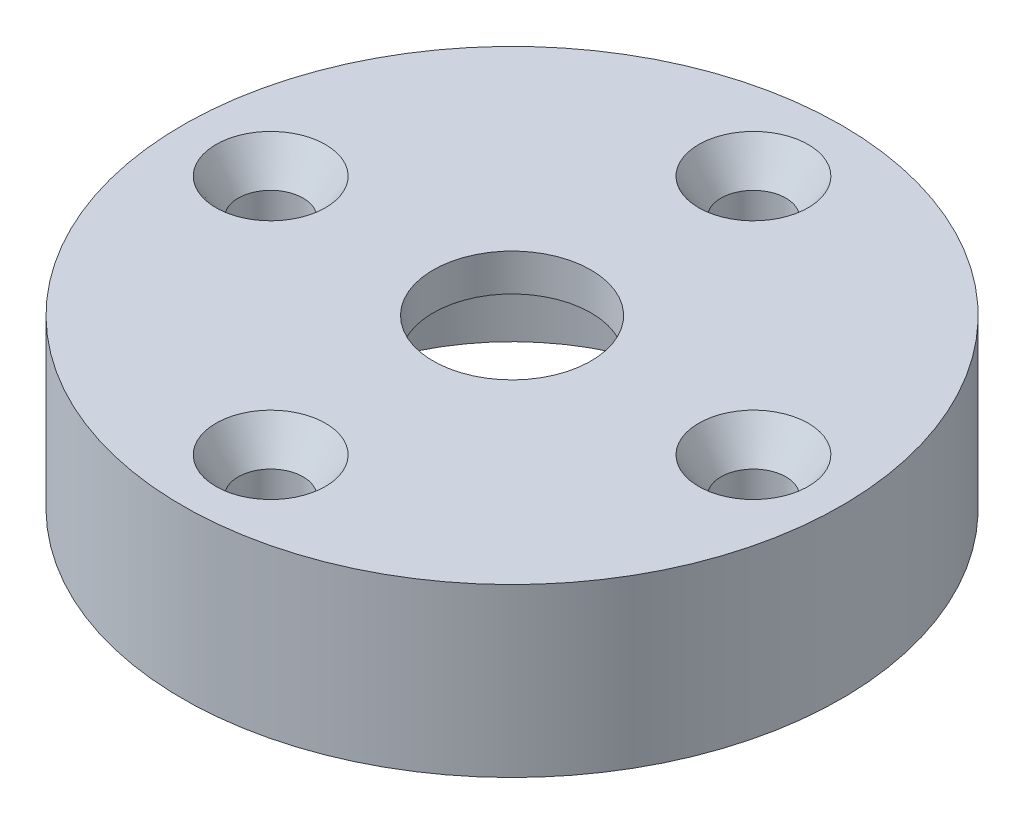
ISO-10303-21;
HEADER;
FILE_DESCRIPTION(('STEP AP214'),'2;1');
FILE_NAME('part.step','',(''),(''),'','','');
FILE_SCHEMA(('AUTOMOTIVE_DESIGN { 1 0 10303 214 1 1 1 1 }'));
ENDSEC;
DATA;
#1=APPLICATION_CONTEXT('core data for automotive mechanical design processes');
#2=APPLICATION_PROTOCOL_DEFINITION('international standard','automotive_design',2000,#1);
#3=PRODUCT_CONTEXT('',#1,'mechanical');
#4=PRODUCT('Part','Part','',(#3));
#5=PRODUCT_RELATED_PRODUCT_CATEGORY('part','',(#4));
#6=PRODUCT_DEFINITION_FORMATION('','',#4);
#7=PRODUCT_DEFINITION_CONTEXT('part definition',#1,'design');
#8=PRODUCT_DEFINITION('design','',#6,#7);
#9=PRODUCT_DEFINITION_SHAPE('','',#8);
#10=(LENGTH_UNIT() NAMED_UNIT(*) SI_UNIT(.MILLI.,.METRE.));
#11=(NAMED_UNIT(*) PLANE_ANGLE_UNIT() SI_UNIT($,.RADIAN.));
#12=(NAMED_UNIT(*) SI_UNIT($,.STERADIAN.) SOLID_ANGLE_UNIT());
#13=UNCERTAINTY_MEASURE_WITH_UNIT(LENGTH_MEASURE(1.E-05),#10,'distance_accuracy_value','');
#14=(GEOMETRIC_REPRESENTATION_CONTEXT(3) GLOBAL_UNCERTAINTY_ASSIGNED_CONTEXT((#13)) GLOBAL_UNIT_ASSIGNED_CONTEXT((#10,
#11,#12)) REPRESENTATION_CONTEXT('',''));
#15=CARTESIAN_POINT('',(0.,0.,0.));
#16=DIRECTION('',(0.,0.,1.));
#17=DIRECTION('',(1.,0.,0.));
#18=AXIS2_PLACEMENT_3D('',#15,#16,#17);
#19=CARTESIAN_POINT('',(0.,0.,0.));
#20=DIRECTION('',(0.,-1.,0.));
#21=DIRECTION('',(0.,0.,-1.));
#22=AXIS2_PLACEMENT_3D('',#19,#20,#21);
#23=CYLINDRICAL_SURFACE('',#22,11.);
#24=CARTESIAN_POINT('',(0.,7.,0.));
#25=DIRECTION('',(0.,-1.,0.));
#26=DIRECTION('',(0.,0.,-1.));
#27=AXIS2_PLACEMENT_3D('',#24,#25,#26);
#28=CIRCLE('',#27,11.);
#29=CARTESIAN_POINT('',(0.,7.,-11.));
#30=VERTEX_POINT('',#29);
#31=EDGE_CURVE('E100',#30,#30,#28,.T.);
#32=ORIENTED_EDGE('',*,*,#31,.F.);
#33=EDGE_LOOP('',(#32));
#34=FACE_BOUND('',#33,.T.);
#35=CARTESIAN_POINT('',(0.,0.,0.));
#36=DIRECTION('',(0.,-1.,0.));
#37=DIRECTION('',(0.,0.,-1.));
#38=AXIS2_PLACEMENT_3D('',#35,#36,#37);
#39=CIRCLE('',#38,11.);
#40=CARTESIAN_POINT('',(0.,0.,-11.));
#41=VERTEX_POINT('',#40);
#42=EDGE_CURVE('E80',#41,#41,#39,.T.);
#43=ORIENTED_EDGE('',*,*,#42,.T.);
#44=EDGE_LOOP('',(#43));
#45=FACE_BOUND('',#44,.T.);
#46=ADVANCED_FACE('F39',(#34,#45),#23,.F.);
#47=CARTESIAN_POINT('',(-11.,0.,0.));
#48=DIRECTION('',(0.,1.,0.));
#49=DIRECTION('',(0.,0.,1.));
#50=AXIS2_PLACEMENT_3D('',#47,#48,#49);
#51=PLANE('',#50);
#52=CARTESIAN_POINT('',(0.,0.,-13.));
#53=DIRECTION('',(0.,1.,0.));
#54=DIRECTION('',(0.,0.,1.));
#55=AXIS2_PLACEMENT_3D('',#52,#53,#54);
#56=CIRCLE('',#55,1.75);
#57=CARTESIAN_POINT('',(0.,0.,-11.25));
#58=VERTEX_POINT('',#57);
#59=EDGE_CURVE('E104',#58,#58,#56,.F.);
#60=ORIENTED_EDGE('',*,*,#59,.F.);
#61=EDGE_LOOP('',(#60));
#62=FACE_BOUND('',#61,.T.);
#63=CARTESIAN_POINT('',(13.,0.,0.));
#64=DIRECTION('',(0.,1.,0.));
#65=DIRECTION('',(0.,0.,1.));
#66=AXIS2_PLACEMENT_3D('',#63,#64,#65);
#67=CIRCLE('',#66,1.75000000000046);
#68=CARTESIAN_POINT('',(13.,0.,1.75000000000046));
#69=VERTEX_POINT('',#68);
#70=EDGE_CURVE('E113',#69,#69,#67,.F.);
#71=ORIENTED_EDGE('',*,*,#70,.F.);
#72=EDGE_LOOP('',(#71));
#73=FACE_BOUND('',#72,.T.);
#74=CARTESIAN_POINT('',(0.,0.,13.));
#75=DIRECTION('',(0.,1.,0.));
#76=DIRECTION('',(0.,0.,1.));
#77=AXIS2_PLACEMENT_3D('',#74,#75,#76);
#78=CIRCLE('',#77,1.7500000000007);
#79=CARTESIAN_POINT('',(0.,0.,14.7500000000007));
#80=VERTEX_POINT('',#79);
#81=EDGE_CURVE('E109',#80,#80,#78,.F.);
#82=ORIENTED_EDGE('',*,*,#81,.F.);
#83=EDGE_LOOP('',(#82));
#84=FACE_BOUND('',#83,.T.);
#85=CARTESIAN_POINT('',(-13.,0.,0.));
#86=DIRECTION('',(0.,1.,0.));
#87=DIRECTION('',(0.,0.,1.));
#88=AXIS2_PLACEMENT_3D('',#85,#86,#87);
#89=CIRCLE('',#88,1.75000000000024);
#90=CARTESIAN_POINT('',(-13.,0.,1.75000000000024));
#91=VERTEX_POINT('',#90);
#92=EDGE_CURVE('E105',#91,#91,#89,.F.);
#93=ORIENTED_EDGE('',*,*,#92,.F.);
#94=EDGE_LOOP('',(#93));
#95=FACE_BOUND('',#94,.T.);
#96=ORIENTED_EDGE('',*,*,#42,.F.);
#97=EDGE_LOOP('',(#96));
#98=FACE_BOUND('',#97,.T.);
#99=CARTESIAN_POINT('',(0.,0.,0.));
#100=DIRECTION('',(0.,-1.,0.));
#101=DIRECTION('',(0.,0.,-1.));
#102=AXIS2_PLACEMENT_3D('',#99,#100,#101);
#103=CIRCLE('',#102,17.75);
#104=CARTESIAN_POINT('',(0.,0.,-17.75));
#105=VERTEX_POINT('',#104);
#106=EDGE_CURVE('E84',#105,#105,#103,.T.);
#107=ORIENTED_EDGE('',*,*,#106,.T.);
#108=EDGE_LOOP('',(#107));
#109=FACE_BOUND('',#108,.T.);
#110=ADVANCED_FACE('F123',(#62,#73,#84,#95,#98,#109),#51,.F.);
#111=CARTESIAN_POINT('',(0.,0.,0.));
#112=DIRECTION('',(0.,-1.,0.));
#113=DIRECTION('',(0.,0.,-1.));
#114=AXIS2_PLACEMENT_3D('',#111,#112,#113);
#115=CYLINDRICAL_SURFACE('',#114,17.75);
#116=ORIENTED_EDGE('',*,*,#106,.F.);
#117=EDGE_LOOP('',(#116));
#118=FACE_BOUND('',#117,.T.);
#119=CARTESIAN_POINT('',(0.,9.,0.));
#120=DIRECTION('',(0.,-1.,0.));
#121=DIRECTION('',(0.,0.,-1.));
#122=AXIS2_PLACEMENT_3D('',#119,#120,#121);
#123=CIRCLE('',#122,17.75);
#124=CARTESIAN_POINT('',(0.,9.,-17.75));
#125=VERTEX_POINT('',#124);
#126=EDGE_CURVE('E88',#125,#125,#123,.T.);
#127=ORIENTED_EDGE('',*,*,#126,.T.);
#128=EDGE_LOOP('',(#127));
#129=FACE_BOUND('',#128,.T.);
#130=ADVANCED_FACE('F126',(#118,#129),#115,.T.);
#131=CARTESIAN_POINT('',(-17.75,9.,0.));
#132=DIRECTION('',(0.,-1.,0.));
#133=DIRECTION('',(0.,0.,-1.));
#134=AXIS2_PLACEMENT_3D('',#131,#132,#133);
#135=PLANE('',#134);
#136=CARTESIAN_POINT('',(0.,9.,13.));
#137=DIRECTION('',(0.,-1.,0.));
#138=DIRECTION('',(0.,0.,-1.));
#139=AXIS2_PLACEMENT_3D('',#136,#137,#138);
#140=CIRCLE('',#139,2.9500000000007);
#141=CARTESIAN_POINT('',(0.,9.,15.9500000000007));
#142=VERTEX_POINT('',#141);
#143=EDGE_CURVE('E58',#142,#142,#140,.T.);
#144=ORIENTED_EDGE('',*,*,#143,.T.);
#145=EDGE_LOOP('',(#144));
#146=FACE_BOUND('',#145,.T.);
#147=CARTESIAN_POINT('',(13.,9.,0.));
#148=DIRECTION('',(0.,-1.,0.));
#149=DIRECTION('',(0.,0.,-1.));
#150=AXIS2_PLACEMENT_3D('',#147,#148,#149);
#151=CIRCLE('',#150,2.95000000000047);
#152=CARTESIAN_POINT('',(13.,9.,-2.95000000000047));
#153=VERTEX_POINT('',#152);
#154=EDGE_CURVE('E64',#153,#153,#151,.T.);
#155=ORIENTED_EDGE('',*,*,#154,.T.);
#156=EDGE_LOOP('',(#155));
#157=FACE_BOUND('',#156,.T.);
#158=CARTESIAN_POINT('',(0.,9.,-13.));
#159=DIRECTION('',(0.,-1.,0.));
#160=DIRECTION('',(0.,0.,-1.));
#161=AXIS2_PLACEMENT_3D('',#158,#159,#160);
#162=CIRCLE('',#161,2.95);
#163=CARTESIAN_POINT('',(0.,9.,-10.05));
#164=VERTEX_POINT('',#163);
#165=EDGE_CURVE('E68',#164,#164,#162,.T.);
#166=ORIENTED_EDGE('',*,*,#165,.T.);
#167=EDGE_LOOP('',(#166));
#168=FACE_BOUND('',#167,.T.);
#169=CARTESIAN_POINT('',(-13.,9.,0.));
#170=DIRECTION('',(0.,-1.,0.));
#171=DIRECTION('',(0.,0.,-1.));
#172=AXIS2_PLACEMENT_3D('',#169,#170,#171);
#173=CIRCLE('',#172,2.95000000000025);
#174=CARTESIAN_POINT('',(-13.,9.,-2.95000000000025));
#175=VERTEX_POINT('',#174);
#176=EDGE_CURVE('E72',#175,#175,#173,.T.);
#177=ORIENTED_EDGE('',*,*,#176,.T.);
#178=EDGE_LOOP('',(#177));
#179=FACE_BOUND('',#178,.T.);
#180=ORIENTED_EDGE('',*,*,#126,.F.);
#181=EDGE_LOOP('',(#180));
#182=FACE_BOUND('',#181,.T.);
#183=CARTESIAN_POINT('',(0.,9.,0.));
#184=DIRECTION('',(0.,-1.,0.));
#185=DIRECTION('',(0.,0.,-1.));
#186=AXIS2_PLACEMENT_3D('',#183,#184,#185);
#187=CIRCLE('',#186,4.25);
#188=CARTESIAN_POINT('',(0.,9.,-4.25));
#189=VERTEX_POINT('',#188);
#190=EDGE_CURVE('E92',#189,#189,#187,.T.);
#191=ORIENTED_EDGE('',*,*,#190,.T.);
#192=EDGE_LOOP('',(#191));
#193=FACE_BOUND('',#192,.T.);
#194=ADVANCED_FACE('F140',(#146,#157,#168,#179,#182,#193),#135,.F.);
#195=CARTESIAN_POINT('',(0.,0.,0.));
#196=DIRECTION('',(0.,-1.,0.));
#197=DIRECTION('',(0.,0.,-1.));
#198=AXIS2_PLACEMENT_3D('',#195,#196,#197);
#199=CYLINDRICAL_SURFACE('',#198,4.25);
#200=ORIENTED_EDGE('',*,*,#190,.F.);
#201=EDGE_LOOP('',(#200));
#202=FACE_BOUND('',#201,.T.);
#203=CARTESIAN_POINT('',(0.,7.,0.));
#204=DIRECTION('',(0.,-1.,0.));
#205=DIRECTION('',(0.,0.,-1.));
#206=AXIS2_PLACEMENT_3D('',#203,#204,#205);
#207=CIRCLE('',#206,4.25);
#208=CARTESIAN_POINT('',(0.,7.,-4.25));
#209=VERTEX_POINT('',#208);
#210=EDGE_CURVE('E96',#209,#209,#207,.T.);
#211=ORIENTED_EDGE('',*,*,#210,.T.);
#212=EDGE_LOOP('',(#211));
#213=FACE_BOUND('',#212,.T.);
#214=ADVANCED_FACE('F146',(#202,#213),#199,.F.);
#215=CARTESIAN_POINT('',(-4.25,7.,0.));
#216=DIRECTION('',(0.,1.,0.));
#217=DIRECTION('',(0.,0.,1.));
#218=AXIS2_PLACEMENT_3D('',#215,#216,#217);
#219=PLANE('',#218);
#220=ORIENTED_EDGE('',*,*,#210,.F.);
#221=EDGE_LOOP('',(#220));
#222=FACE_BOUND('',#221,.T.);
#223=ORIENTED_EDGE('',*,*,#31,.T.);
#224=EDGE_LOOP('',(#223));
#225=FACE_BOUND('',#224,.T.);
#226=ADVANCED_FACE('F153',(#222,#225),#219,.F.);
#227=CARTESIAN_POINT('',(-13.,-4.94974746830781,0.));
#228=DIRECTION('',(0.,1.,0.));
#229=DIRECTION('',(0.,0.,1.));
#230=AXIS2_PLACEMENT_3D('',#227,#228,#229);
#231=CYLINDRICAL_SURFACE('',#230,1.75000000000024);
#232=CARTESIAN_POINT('',(-13.,7.09999999999998,0.));
#233=DIRECTION('',(0.,-1.,0.));
#234=DIRECTION('',(0.,0.,-1.));
#235=AXIS2_PLACEMENT_3D('',#232,#233,#234);
#236=CIRCLE('',#235,1.75000000000024);
#237=CARTESIAN_POINT('',(-13.,7.09999999999998,-1.75000000000024));
#238=VERTEX_POINT('',#237);
#239=EDGE_CURVE('E10',#238,#238,#236,.F.);
#240=ORIENTED_EDGE('',*,*,#239,.T.);
#241=EDGE_LOOP('',(#240));
#242=FACE_BOUND('',#241,.T.);
#243=ORIENTED_EDGE('',*,*,#92,.T.);
#244=EDGE_LOOP('',(#243));
#245=FACE_BOUND('',#244,.T.);
#246=ADVANCED_FACE('F159',(#242,#245),#231,.F.);
#247=CARTESIAN_POINT('',(0.,-4.94974746830781,13.));
#248=DIRECTION('',(0.,1.,0.));
#249=DIRECTION('',(0.,0.,1.));
#250=AXIS2_PLACEMENT_3D('',#247,#248,#249);
#251=CYLINDRICAL_SURFACE('',#250,1.7500000000007);
#252=CARTESIAN_POINT('',(0.,7.09999999999999,13.));
#253=DIRECTION('',(0.,-1.,0.));
#254=DIRECTION('',(0.,0.,-1.));
#255=AXIS2_PLACEMENT_3D('',#252,#253,#254);
#256=CIRCLE('',#255,1.7500000000007);
#257=CARTESIAN_POINT('',(0.,7.09999999999999,14.7500000000007));
#258=VERTEX_POINT('',#257);
#259=EDGE_CURVE('E76',#258,#258,#256,.F.);
#260=ORIENTED_EDGE('',*,*,#259,.T.);
#261=EDGE_LOOP('',(#260));
#262=FACE_BOUND('',#261,.T.);
#263=ORIENTED_EDGE('',*,*,#81,.T.);
#264=EDGE_LOOP('',(#263));
#265=FACE_BOUND('',#264,.T.);
#266=ADVANCED_FACE('F234',(#262,#265),#251,.F.);
#267=CARTESIAN_POINT('',(13.,-4.94974746830781,0.));
#268=DIRECTION('',(0.,1.,0.));
#269=DIRECTION('',(0.,0.,1.));
#270=AXIS2_PLACEMENT_3D('',#267,#268,#269);
#271=CYLINDRICAL_SURFACE('',#270,1.75000000000046);
#272=CARTESIAN_POINT('',(13.,7.09999999999997,0.));
#273=DIRECTION('',(0.,-1.,0.));
#274=DIRECTION('',(0.,0.,-1.));
#275=AXIS2_PLACEMENT_3D('',#272,#273,#274);
#276=CIRCLE('',#275,1.75000000000046);
#277=CARTESIAN_POINT('',(13.,7.09999999999997,-1.75000000000045));
#278=VERTEX_POINT('',#277);
#279=EDGE_CURVE('E53',#278,#278,#276,.F.);
#280=ORIENTED_EDGE('',*,*,#279,.T.);
#281=EDGE_LOOP('',(#280));
#282=FACE_BOUND('',#281,.T.);
#283=ORIENTED_EDGE('',*,*,#70,.T.);
#284=EDGE_LOOP('',(#283));
#285=FACE_BOUND('',#284,.T.);
#286=ADVANCED_FACE('F225',(#282,#285),#271,.F.);
#287=CARTESIAN_POINT('',(0.,-4.94974746830781,-13.));
#288=DIRECTION('',(0.,1.,0.));
#289=DIRECTION('',(0.,0.,1.));
#290=AXIS2_PLACEMENT_3D('',#287,#288,#289);
#291=CYLINDRICAL_SURFACE('',#290,1.75);
#292=CARTESIAN_POINT('',(0.,7.09999999999999,-13.));
#293=DIRECTION('',(0.,-1.,0.));
#294=DIRECTION('',(0.,0.,-1.));
#295=AXIS2_PLACEMENT_3D('',#292,#293,#294);
#296=CIRCLE('',#295,1.75);
#297=CARTESIAN_POINT('',(0.,7.09999999999999,-11.25));
#298=VERTEX_POINT('',#297);
#299=EDGE_CURVE('E48',#298,#298,#296,.F.);
#300=ORIENTED_EDGE('',*,*,#299,.T.);
#301=EDGE_LOOP('',(#300));
#302=FACE_BOUND('',#301,.T.);
#303=ORIENTED_EDGE('',*,*,#59,.T.);
#304=EDGE_LOOP('',(#303));
#305=FACE_BOUND('',#304,.T.);
#306=ADVANCED_FACE('F121',(#302,#305),#291,.F.);
#307=CARTESIAN_POINT('',(0.,7.09999999999999,13.));
#308=DIRECTION('',(0.,1.,0.));
#309=DIRECTION('',(0.,0.,1.));
#310=AXIS2_PLACEMENT_3D('',#307,#308,#309);
#311=CONICAL_SURFACE('',#310,1.7500000000007,0.563316261491968);
#312=CARTESIAN_POINT('',(0.,9.,15.9500000000007));
#313=CARTESIAN_POINT('',(0.,8.98020833333334,15.9375000000007));
#314=CARTESIAN_POINT('',(0.,8.96041666666667,15.9250000000007));
#315=CARTESIAN_POINT('',(0.,8.92083333333334,15.9000000000007));
#316=CARTESIAN_POINT('',(0.,8.90104166666667,15.8875000000007));
#317=CARTESIAN_POINT('',(0.,8.86145833333333,15.8625000000007));
#318=CARTESIAN_POINT('',(0.,8.84166666666667,15.8500000000007));
#319=CARTESIAN_POINT('',(0.,8.80208333333334,15.8250000000007));
#320=CARTESIAN_POINT('',(0.,8.78229166666667,15.8125000000007));
#321=CARTESIAN_POINT('',(0.,8.74270833333333,15.7875000000007));
#322=CARTESIAN_POINT('',(0.,8.72291666666667,15.7750000000007));
#323=CARTESIAN_POINT('',(0.,8.68333333333334,15.7500000000007));
#324=CARTESIAN_POINT('',(0.,8.66354166666667,15.7375000000007));
#325=CARTESIAN_POINT('',(0.,8.62395833333333,15.7125000000007));
#326=CARTESIAN_POINT('',(0.,8.60416666666667,15.7000000000007));
#327=CARTESIAN_POINT('',(0.,8.56458333333333,15.6750000000007));
#328=CARTESIAN_POINT('',(0.,8.54479166666667,15.6625000000007));
#329=CARTESIAN_POINT('',(0.,8.50520833333333,15.6375000000007));
#330=CARTESIAN_POINT('',(0.,8.48541666666667,15.6250000000007));
#331=CARTESIAN_POINT('',(0.,8.44583333333333,15.6000000000007));
#332=CARTESIAN_POINT('',(0.,8.42604166666666,15.5875000000007));
#333=CARTESIAN_POINT('',(0.,8.38645833333333,15.5625000000007));
#334=CARTESIAN_POINT('',(0.,8.36666666666667,15.5500000000007));
#335=CARTESIAN_POINT('',(0.,8.32708333333333,15.5250000000007));
#336=CARTESIAN_POINT('',(0.,8.30729166666666,15.5125000000007));
#337=CARTESIAN_POINT('',(0.,8.26770833333333,15.4875000000007));
#338=CARTESIAN_POINT('',(0.,8.24791666666666,15.4750000000007));
#339=CARTESIAN_POINT('',(0.,8.20833333333333,15.4500000000007));
#340=CARTESIAN_POINT('',(0.,8.18854166666666,15.4375000000007));
#341=CARTESIAN_POINT('',(0.,8.14895833333333,15.4125000000007));
#342=CARTESIAN_POINT('',(0.,8.12916666666666,15.4000000000007));
#343=CARTESIAN_POINT('',(0.,8.08958333333333,15.3750000000007));
#344=CARTESIAN_POINT('',(0.,8.06979166666666,15.3625000000007));
#345=CARTESIAN_POINT('',(0.,8.03020833333333,15.3375000000007));
#346=CARTESIAN_POINT('',(0.,8.01041666666666,15.3250000000007));
#347=CARTESIAN_POINT('',(0.,7.97083333333333,15.3000000000007));
#348=CARTESIAN_POINT('',(0.,7.95104166666666,15.2875000000007));
#349=CARTESIAN_POINT('',(0.,7.91145833333333,15.2625000000007));
#350=CARTESIAN_POINT('',(0.,7.89166666666666,15.2500000000007));
#351=CARTESIAN_POINT('',(0.,7.85208333333333,15.2250000000007));
#352=CARTESIAN_POINT('',(0.,7.83229166666666,15.2125000000007));
#353=CARTESIAN_POINT('',(0.,7.79270833333333,15.1875000000007));
#354=CARTESIAN_POINT('',(0.,7.77291666666666,15.1750000000007));
#355=CARTESIAN_POINT('',(0.,7.73333333333333,15.1500000000007));
#356=CARTESIAN_POINT('',(0.,7.71354166666666,15.1375000000007));
#357=CARTESIAN_POINT('',(0.,7.67395833333333,15.1125000000007));
#358=CARTESIAN_POINT('',(0.,7.65416666666666,15.1000000000007));
#359=CARTESIAN_POINT('',(0.,7.61458333333333,15.0750000000007));
#360=CARTESIAN_POINT('',(0.,7.59479166666666,15.0625000000007));
#361=CARTESIAN_POINT('',(0.,7.55520833333333,15.0375000000007));
#362=CARTESIAN_POINT('',(0.,7.53541666666666,15.0250000000007));
#363=CARTESIAN_POINT('',(0.,7.49583333333333,15.0000000000007));
#364=CARTESIAN_POINT('',(0.,7.47604166666666,14.9875000000007));
#365=CARTESIAN_POINT('',(0.,7.43645833333333,14.9625000000007));
#366=CARTESIAN_POINT('',(0.,7.41666666666666,14.9500000000007));
#367=CARTESIAN_POINT('',(0.,7.37708333333333,14.9250000000007));
#368=CARTESIAN_POINT('',(0.,7.35729166666666,14.9125000000007));
#369=CARTESIAN_POINT('',(0.,7.31770833333332,14.8875000000007));
#370=CARTESIAN_POINT('',(0.,7.29791666666666,14.8750000000007));
#371=CARTESIAN_POINT('',(0.,7.25833333333332,14.8500000000007));
#372=CARTESIAN_POINT('',(0.,7.23854166666666,14.8375000000007));
#373=CARTESIAN_POINT('',(0.,7.19895833333332,14.8125000000007));
#374=CARTESIAN_POINT('',(0.,7.17916666666666,14.8000000000007));
#375=CARTESIAN_POINT('',(0.,7.13958333333332,14.7750000000007));
#376=CARTESIAN_POINT('',(0.,7.11979166666666,14.7625000000007));
#377=CARTESIAN_POINT('',(0.,7.09999999999999,14.7500000000007));
#378=B_SPLINE_CURVE_WITH_KNOTS('',3,(#312,#313,#314,#315,#316,#317,#318,#319,#320,#321,#322,
#323,#324,#325,#326,#327,#328,#329,#330,#331,#332,#333,#334,#335,#336,#337,#338,#339,#340,#341,
#342,#343,#344,#345,#346,#347,#348,#349,#350,#351,#352,#353,#354,#355,#356,#357,#358,#359,#360,
#361,#362,#363,#364,#365,#366,#367,#368,#369,#370,#371,#372,#373,#374,#375,#376,#377),
.UNSPECIFIED.,.F.,.F.,(4,2,2,2,2,2,2,2,2,2,2,2,2,2,2,2,2,2,2,2,2,2,2,2,2,2,2,2,2,2,2,2,4),(0.,
0.0702256407945132,0.140451281589028,0.210676922383541,0.280902563178055,0.35112820397257,
0.421353844767083,0.491579485561596,0.561805126356109,0.632030767150624,0.702256407945138,
0.772482048739651,0.842707689534165,0.912933330328678,0.983158971123192,1.05338461191771,
1.12361025271222,1.19383589350673,1.26406153430125,1.33428717509576,1.40451281589027,
1.47473845668479,1.5449640974793,1.61518973827381,1.68541537906833,1.75564101986284,
1.82586666065736,1.89609230145187,1.96631794224638,2.0365435830409,2.10676922383541,
2.17699486462993,2.24722050542444),.UNSPECIFIED.);
#379=EDGE_CURVE('BSEAM170',#142,#258,#378,.T.);
#380=ORIENTED_EDGE('',*,*,#143,.F.);
#381=ORIENTED_EDGE('',*,*,#259,.F.);
#382=ORIENTED_EDGE('',*,*,#379,.T.);
#383=ORIENTED_EDGE('',*,*,#379,.F.);
#384=EDGE_LOOP('',(#380,#382,#381,#383));
#385=FACE_BOUND('',#384,.T.);
#386=ADVANCED_FACE('F170',(#385),#311,.F.);
#387=CARTESIAN_POINT('',(13.,7.09999999999997,0.));
#388=DIRECTION('',(0.,1.,0.));
#389=DIRECTION('',(0.,0.,1.));
#390=AXIS2_PLACEMENT_3D('',#387,#388,#389);
#391=CONICAL_SURFACE('',#390,1.75000000000046,0.563316261491968);
#392=ORIENTED_EDGE('',*,*,#154,.F.);
#393=EDGE_LOOP('',(#392));
#394=FACE_BOUND('',#393,.T.);
#395=ORIENTED_EDGE('',*,*,#279,.F.);
#396=EDGE_LOOP('',(#395));
#397=FACE_BOUND('',#396,.T.);
#398=ADVANCED_FACE('F176',(#394,#397),#391,.F.);
#399=CARTESIAN_POINT('',(0.,7.09999999999999,-13.));
#400=DIRECTION('',(0.,1.,0.));
#401=DIRECTION('',(0.,0.,1.));
#402=AXIS2_PLACEMENT_3D('',#399,#400,#401);
#403=CONICAL_SURFACE('',#402,1.75,0.563316261491966);
#404=CARTESIAN_POINT('',(0.,9.,-10.05));
#405=CARTESIAN_POINT('',(0.,8.98020833333334,-10.0625));
#406=CARTESIAN_POINT('',(0.,8.96041666666667,-10.075));
#407=CARTESIAN_POINT('',(0.,8.92083333333334,-10.1));
#408=CARTESIAN_POINT('',(0.,8.90104166666667,-10.1125));
#409=CARTESIAN_POINT('',(0.,8.86145833333333,-10.1375));
#410=CARTESIAN_POINT('',(0.,8.84166666666667,-10.15));
#411=CARTESIAN_POINT('',(0.,8.80208333333334,-10.175));
#412=CARTESIAN_POINT('',(0.,8.78229166666667,-10.1875));
#413=CARTESIAN_POINT('',(0.,8.74270833333333,-10.2125));
#414=CARTESIAN_POINT('',(0.,8.72291666666667,-10.225));
#415=CARTESIAN_POINT('',(0.,8.68333333333334,-10.25));
#416=CARTESIAN_POINT('',(0.,8.66354166666667,-10.2625));
#417=CARTESIAN_POINT('',(0.,8.62395833333333,-10.2875));
#418=CARTESIAN_POINT('',(0.,8.60416666666667,-10.3));
#419=CARTESIAN_POINT('',(0.,8.56458333333333,-10.325));
#420=CARTESIAN_POINT('',(0.,8.54479166666667,-10.3375));
#421=CARTESIAN_POINT('',(0.,8.50520833333333,-10.3625));
#422=CARTESIAN_POINT('',(0.,8.48541666666667,-10.375));
#423=CARTESIAN_POINT('',(0.,8.44583333333333,-10.4));
#424=CARTESIAN_POINT('',(0.,8.42604166666666,-10.4125));
#425=CARTESIAN_POINT('',(0.,8.38645833333333,-10.4375));
#426=CARTESIAN_POINT('',(0.,8.36666666666667,-10.45));
#427=CARTESIAN_POINT('',(0.,8.32708333333333,-10.475));
#428=CARTESIAN_POINT('',(0.,8.30729166666666,-10.4875));
#429=CARTESIAN_POINT('',(0.,8.26770833333333,-10.5125));
#430=CARTESIAN_POINT('',(0.,8.24791666666666,-10.525));
#431=CARTESIAN_POINT('',(0.,8.20833333333333,-10.55));
#432=CARTESIAN_POINT('',(0.,8.18854166666666,-10.5625));
#433=CARTESIAN_POINT('',(0.,8.14895833333333,-10.5875));
#434=CARTESIAN_POINT('',(0.,8.12916666666666,-10.6));
#435=CARTESIAN_POINT('',(0.,8.08958333333333,-10.625));
#436=CARTESIAN_POINT('',(0.,8.06979166666666,-10.6375));
#437=CARTESIAN_POINT('',(0.,8.03020833333333,-10.6625));
#438=CARTESIAN_POINT('',(0.,8.01041666666666,-10.675));
#439=CARTESIAN_POINT('',(0.,7.97083333333333,-10.7));
#440=CARTESIAN_POINT('',(0.,7.95104166666666,-10.7125));
#441=CARTESIAN_POINT('',(0.,7.91145833333333,-10.7375));
#442=CARTESIAN_POINT('',(0.,7.89166666666666,-10.75));
#443=CARTESIAN_POINT('',(0.,7.85208333333333,-10.775));
#444=CARTESIAN_POINT('',(0.,7.83229166666666,-10.7875));
#445=CARTESIAN_POINT('',(0.,7.79270833333333,-10.8125));
#446=CARTESIAN_POINT('',(0.,7.77291666666666,-10.825));
#447=CARTESIAN_POINT('',(0.,7.73333333333333,-10.85));
#448=CARTESIAN_POINT('',(0.,7.71354166666666,-10.8625));
#449=CARTESIAN_POINT('',(0.,7.67395833333333,-10.8875));
#450=CARTESIAN_POINT('',(0.,7.65416666666666,-10.9));
#451=CARTESIAN_POINT('',(0.,7.61458333333333,-10.925));
#452=CARTESIAN_POINT('',(0.,7.59479166666666,-10.9375));
#453=CARTESIAN_POINT('',(0.,7.55520833333333,-10.9625));
#454=CARTESIAN_POINT('',(0.,7.53541666666666,-10.975));
#455=CARTESIAN_POINT('',(0.,7.49583333333333,-11.));
#456=CARTESIAN_POINT('',(0.,7.47604166666666,-11.0125));
#457=CARTESIAN_POINT('',(0.,7.43645833333333,-11.0375));
#458=CARTESIAN_POINT('',(0.,7.41666666666666,-11.05));
#459=CARTESIAN_POINT('',(0.,7.37708333333333,-11.075));
#460=CARTESIAN_POINT('',(0.,7.35729166666666,-11.0875));
#461=CARTESIAN_POINT('',(0.,7.31770833333332,-11.1125));
#462=CARTESIAN_POINT('',(0.,7.29791666666666,-11.125));
#463=CARTESIAN_POINT('',(0.,7.25833333333332,-11.15));
#464=CARTESIAN_POINT('',(0.,7.23854166666666,-11.1625));
#465=CARTESIAN_POINT('',(0.,7.19895833333332,-11.1875));
#466=CARTESIAN_POINT('',(0.,7.17916666666666,-11.2));
#467=CARTESIAN_POINT('',(0.,7.13958333333332,-11.225));
#468=CARTESIAN_POINT('',(0.,7.11979166666666,-11.2375));
#469=CARTESIAN_POINT('',(0.,7.09999999999999,-11.25));
#470=B_SPLINE_CURVE_WITH_KNOTS('',3,(#404,#405,#406,#407,#408,#409,#410,#411,#412,#413,#414,
#415,#416,#417,#418,#419,#420,#421,#422,#423,#424,#425,#426,#427,#428,#429,#430,#431,#432,#433,
#434,#435,#436,#437,#438,#439,#440,#441,#442,#443,#444,#445,#446,#447,#448,#449,#450,#451,#452,
#453,#454,#455,#456,#457,#458,#459,#460,#461,#462,#463,#464,#465,#466,#467,#468,#469),
.UNSPECIFIED.,.F.,.F.,(4,2,2,2,2,2,2,2,2,2,2,2,2,2,2,2,2,2,2,2,2,2,2,2,2,2,2,2,2,2,2,2,4),(0.,
0.0702256407945132,0.140451281589026,0.210676922383541,0.280902563178054,0.351128203972568,
0.421353844767081,0.491579485561594,0.561805126356108,0.632030767150622,0.702256407945136,
0.772482048739649,0.842707689534162,0.912933330328676,0.983158971123191,1.0533846119177,
1.12361025271222,1.19383589350673,1.26406153430124,1.33428717509576,1.40451281589027,
1.47473845668478,1.5449640974793,1.61518973827381,1.68541537906833,1.75564101986284,
1.82586666065735,1.89609230145187,1.96631794224638,2.03654358304089,2.10676922383541,
2.17699486462992,2.24722050542443),.UNSPECIFIED.);
#471=EDGE_CURVE('BSEAM182',#164,#298,#470,.T.);
#472=ORIENTED_EDGE('',*,*,#165,.F.);
#473=ORIENTED_EDGE('',*,*,#299,.F.);
#474=ORIENTED_EDGE('',*,*,#471,.T.);
#475=ORIENTED_EDGE('',*,*,#471,.F.);
#476=EDGE_LOOP('',(#472,#474,#473,#475));
#477=FACE_BOUND('',#476,.T.);
#478=ADVANCED_FACE('F182',(#477),#403,.F.);
#479=CARTESIAN_POINT('',(-13.,7.09999999999998,0.));
#480=DIRECTION('',(0.,1.,0.));
#481=DIRECTION('',(0.,0.,1.));
#482=AXIS2_PLACEMENT_3D('',#479,#480,#481);
#483=CONICAL_SURFACE('',#482,1.75000000000024,0.563316261491965);
#484=ORIENTED_EDGE('',*,*,#176,.F.);
#485=EDGE_LOOP('',(#484));
#486=FACE_BOUND('',#485,.T.);
#487=ORIENTED_EDGE('',*,*,#239,.F.);
#488=EDGE_LOOP('',(#487));
#489=FACE_BOUND('',#488,.T.);
#490=ADVANCED_FACE('F42',(#486,#489),#483,.F.);
#491=CLOSED_SHELL('',(#46,#110,#130,#194,#214,#226,#246,#266,#286,#306,#386,#398,#478,#490));
#492=MANIFOLD_SOLID_BREP('B2',#491);
#493=ADVANCED_BREP_SHAPE_REPRESENTATION('',(#18,#492),#14);
#494=SHAPE_DEFINITION_REPRESENTATION(#9,#493);
ENDSEC;
END-ISO-10303-21;
